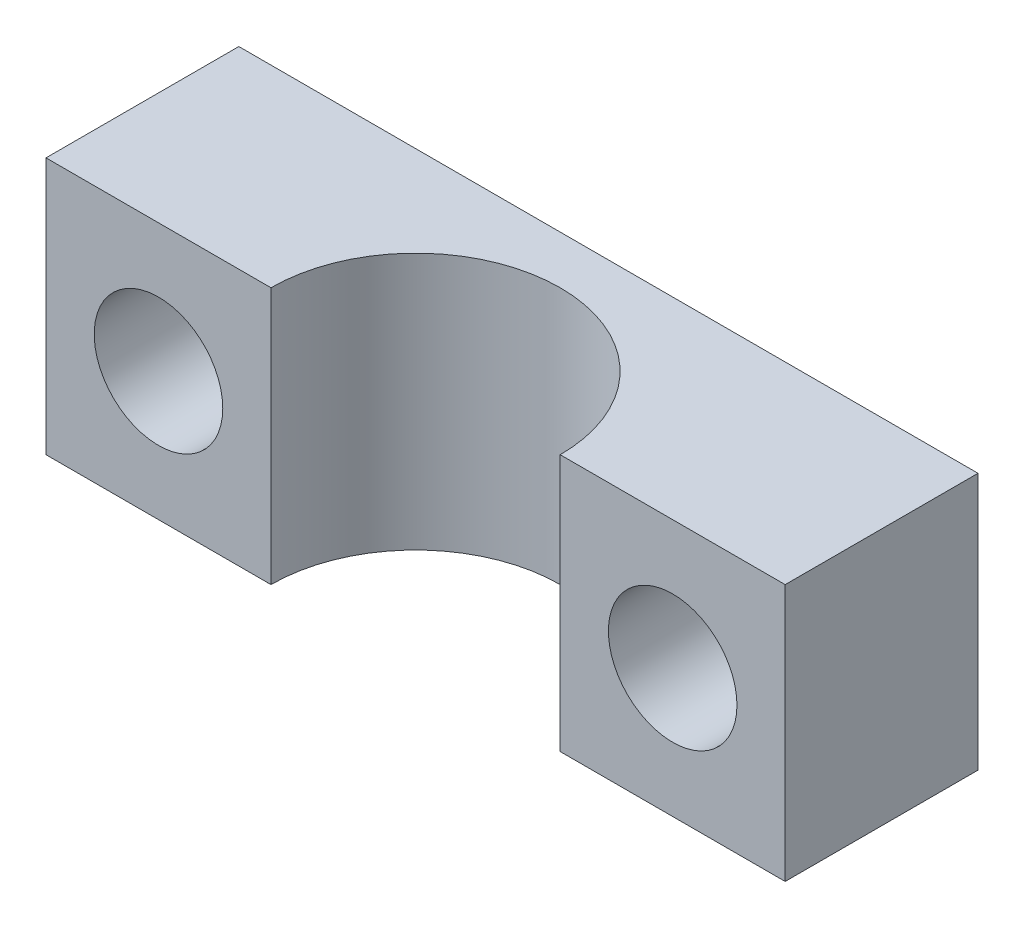
ISO-10303-21;
HEADER;
FILE_DESCRIPTION(('STEP AP214'),'2;1');
FILE_NAME('part.step','',(''),(''),'','','');
FILE_SCHEMA(('AUTOMOTIVE_DESIGN { 1 0 10303 214 1 1 1 1 }'));
ENDSEC;
DATA;
#1=APPLICATION_CONTEXT('core data for automotive mechanical design processes');
#2=APPLICATION_PROTOCOL_DEFINITION('international standard','automotive_design',2000,#1);
#3=PRODUCT_CONTEXT('',#1,'mechanical');
#4=PRODUCT('Part','Part','',(#3));
#5=PRODUCT_RELATED_PRODUCT_CATEGORY('part','',(#4));
#6=PRODUCT_DEFINITION_FORMATION('','',#4);
#7=PRODUCT_DEFINITION_CONTEXT('part definition',#1,'design');
#8=PRODUCT_DEFINITION('design','',#6,#7);
#9=PRODUCT_DEFINITION_SHAPE('','',#8);
#10=(LENGTH_UNIT() NAMED_UNIT(*) SI_UNIT(.MILLI.,.METRE.));
#11=(NAMED_UNIT(*) PLANE_ANGLE_UNIT() SI_UNIT($,.RADIAN.));
#12=(NAMED_UNIT(*) SI_UNIT($,.STERADIAN.) SOLID_ANGLE_UNIT());
#13=UNCERTAINTY_MEASURE_WITH_UNIT(LENGTH_MEASURE(1.E-05),#10,'distance_accuracy_value','');
#14=(GEOMETRIC_REPRESENTATION_CONTEXT(3) GLOBAL_UNCERTAINTY_ASSIGNED_CONTEXT((#13)) GLOBAL_UNIT_ASSIGNED_CONTEXT((#10,
#11,#12)) REPRESENTATION_CONTEXT('',''));
#15=CARTESIAN_POINT('',(0.,0.,0.));
#16=DIRECTION('',(0.,0.,1.));
#17=DIRECTION('',(1.,0.,0.));
#18=AXIS2_PLACEMENT_3D('',#15,#16,#17);
#19=CARTESIAN_POINT('',(-59.6296296296296,43.505291005291,60.));
#20=DIRECTION('',(1.,0.,0.));
#21=DIRECTION('',(0.,0.,-1.));
#22=AXIS2_PLACEMENT_3D('',#19,#20,#21);
#23=PLANE('',#22);
#24=DIRECTION('',(0.,0.,-1.));
#25=VECTOR('',#24,1.);
#26=CARTESIAN_POINT('',(-59.6296296296296,3.50529100529105,60.));
#27=LINE('',#26,#25);
#28=CARTESIAN_POINT('',(-59.6296296296296,3.50529100529105,30.));
#29=VERTEX_POINT('',#28);
#30=CARTESIAN_POINT('',(-59.6296296296296,3.50529100529105,0.));
#31=VERTEX_POINT('',#30);
#32=EDGE_CURVE('E11',#29,#31,#27,.T.);
#33=ORIENTED_EDGE('',*,*,#32,.F.);
#34=DIRECTION('',(0.,1.,0.));
#35=VECTOR('',#34,1.);
#36=CARTESIAN_POINT('',(-59.6296296296296,-16.494708994709,30.));
#37=LINE('',#36,#35);
#38=CARTESIAN_POINT('',(-59.6296296296296,43.505291005291,30.));
#39=VERTEX_POINT('',#38);
#40=EDGE_CURVE('E117',#29,#39,#37,.T.);
#41=ORIENTED_EDGE('',*,*,#40,.T.);
#42=DIRECTION('',(0.,0.,-1.));
#43=VECTOR('',#42,1.);
#44=CARTESIAN_POINT('',(-59.6296296296296,43.505291005291,60.));
#45=LINE('',#44,#43);
#46=CARTESIAN_POINT('',(-59.6296296296296,43.505291005291,0.));
#47=VERTEX_POINT('',#46);
#48=EDGE_CURVE('E62',#39,#47,#45,.T.);
#49=ORIENTED_EDGE('',*,*,#48,.T.);
#50=DIRECTION('',(0.,-1.,0.));
#51=VECTOR('',#50,1.);
#52=CARTESIAN_POINT('',(-59.6296296296296,43.505291005291,0.));
#53=LINE('',#52,#51);
#54=EDGE_CURVE('E127',#47,#31,#53,.T.);
#55=ORIENTED_EDGE('',*,*,#54,.T.);
#56=EDGE_LOOP('',(#33,#41,#49,#55));
#57=FACE_BOUND('',#56,.T.);
#58=ADVANCED_FACE('F40',(#57),#23,.F.);
#59=CARTESIAN_POINT('',(-59.6296296296296,3.50529100529105,60.));
#60=DIRECTION('',(0.,1.,0.));
#61=DIRECTION('',(0.,0.,1.));
#62=AXIS2_PLACEMENT_3D('',#59,#60,#61);
#63=PLANE('',#62);
#64=CARTESIAN_POINT('',(-2.12962962962962,3.50529100529105,30.));
#65=DIRECTION('',(0.,1.,0.));
#66=DIRECTION('',(0.,0.,1.));
#67=AXIS2_PLACEMENT_3D('',#64,#65,#66);
#68=CIRCLE('',#67,22.5);
#69=CARTESIAN_POINT('',(20.3703703703704,3.50529100529105,30.));
#70=VERTEX_POINT('',#69);
#71=CARTESIAN_POINT('',(-24.6296296296296,3.50529100529105,30.));
#72=VERTEX_POINT('',#71);
#73=EDGE_CURVE('E101',#70,#72,#68,.T.);
#74=ORIENTED_EDGE('',*,*,#73,.T.);
#75=DIRECTION('',(-1.,0.,0.));
#76=VECTOR('',#75,1.);
#77=CARTESIAN_POINT('',(-59.6296296296296,3.50529100529105,30.));
#78=LINE('',#77,#76);
#79=EDGE_CURVE('E124',#72,#29,#78,.T.);
#80=ORIENTED_EDGE('',*,*,#79,.T.);
#81=ORIENTED_EDGE('',*,*,#32,.T.);
#82=DIRECTION('',(1.,0.,0.));
#83=VECTOR('',#82,1.);
#84=CARTESIAN_POINT('',(-59.6296296296296,3.50529100529105,0.));
#85=LINE('',#84,#83);
#86=CARTESIAN_POINT('',(55.3703703703704,3.50529100529105,0.));
#87=VERTEX_POINT('',#86);
#88=EDGE_CURVE('E129',#31,#87,#85,.T.);
#89=ORIENTED_EDGE('',*,*,#88,.T.);
#90=DIRECTION('',(0.,0.,-1.));
#91=VECTOR('',#90,1.);
#92=CARTESIAN_POINT('',(55.3703703703704,3.50529100529105,60.));
#93=LINE('',#92,#91);
#94=CARTESIAN_POINT('',(55.3703703703704,3.50529100529105,30.));
#95=VERTEX_POINT('',#94);
#96=EDGE_CURVE('E47',#95,#87,#93,.T.);
#97=ORIENTED_EDGE('',*,*,#96,.F.);
#98=DIRECTION('',(-1.,0.,0.));
#99=VECTOR('',#98,1.);
#100=CARTESIAN_POINT('',(-59.6296296296296,3.50529100529105,30.));
#101=LINE('',#100,#99);
#102=EDGE_CURVE('E119',#95,#70,#101,.T.);
#103=ORIENTED_EDGE('',*,*,#102,.T.);
#104=EDGE_LOOP('',(#74,#80,#81,#89,#97,#103));
#105=FACE_BOUND('',#104,.T.);
#106=ADVANCED_FACE('F146',(#105),#63,.F.);
#107=CARTESIAN_POINT('',(55.3703703703704,43.505291005291,60.));
#108=DIRECTION('',(-1.,0.,0.));
#109=DIRECTION('',(0.,-1.,0.));
#110=AXIS2_PLACEMENT_3D('',#107,#108,#109);
#111=PLANE('',#110);
#112=DIRECTION('',(0.,0.,-1.));
#113=VECTOR('',#112,1.);
#114=CARTESIAN_POINT('',(55.3703703703704,43.505291005291,60.));
#115=LINE('',#114,#113);
#116=CARTESIAN_POINT('',(55.3703703703704,43.505291005291,30.));
#117=VERTEX_POINT('',#116);
#118=CARTESIAN_POINT('',(55.3703703703704,43.505291005291,0.));
#119=VERTEX_POINT('',#118);
#120=EDGE_CURVE('E138',#117,#119,#115,.T.);
#121=ORIENTED_EDGE('',*,*,#120,.F.);
#122=DIRECTION('',(0.,1.,0.));
#123=VECTOR('',#122,1.);
#124=CARTESIAN_POINT('',(55.3703703703704,-16.494708994709,30.));
#125=LINE('',#124,#123);
#126=EDGE_CURVE('E54',#95,#117,#125,.T.);
#127=ORIENTED_EDGE('',*,*,#126,.F.);
#128=ORIENTED_EDGE('',*,*,#96,.T.);
#129=DIRECTION('',(0.,1.,0.));
#130=VECTOR('',#129,1.);
#131=CARTESIAN_POINT('',(55.3703703703704,43.505291005291,0.));
#132=LINE('',#131,#130);
#133=EDGE_CURVE('E132',#87,#119,#132,.T.);
#134=ORIENTED_EDGE('',*,*,#133,.T.);
#135=EDGE_LOOP('',(#121,#127,#128,#134));
#136=FACE_BOUND('',#135,.T.);
#137=ADVANCED_FACE('F141',(#136),#111,.F.);
#138=CARTESIAN_POINT('',(-59.6296296296296,43.505291005291,60.));
#139=DIRECTION('',(0.,-1.,0.));
#140=DIRECTION('',(0.,0.,-1.));
#141=AXIS2_PLACEMENT_3D('',#138,#139,#140);
#142=PLANE('',#141);
#143=ORIENTED_EDGE('',*,*,#48,.F.);
#144=DIRECTION('',(-1.,0.,0.));
#145=VECTOR('',#144,1.);
#146=CARTESIAN_POINT('',(-59.6296296296296,43.505291005291,30.));
#147=LINE('',#146,#145);
#148=CARTESIAN_POINT('',(-24.6296296296296,43.505291005291,30.));
#149=VERTEX_POINT('',#148);
#150=EDGE_CURVE('E112',#149,#39,#147,.T.);
#151=ORIENTED_EDGE('',*,*,#150,.F.);
#152=CARTESIAN_POINT('',(-2.12962962962962,43.505291005291,30.));
#153=DIRECTION('',(0.,1.,0.));
#154=DIRECTION('',(0.,0.,1.));
#155=AXIS2_PLACEMENT_3D('',#152,#153,#154);
#156=CIRCLE('',#155,22.5);
#157=CARTESIAN_POINT('',(20.3703703703704,43.505291005291,30.));
#158=VERTEX_POINT('',#157);
#159=EDGE_CURVE('E98',#158,#149,#156,.T.);
#160=ORIENTED_EDGE('',*,*,#159,.F.);
#161=DIRECTION('',(-1.,0.,0.));
#162=VECTOR('',#161,1.);
#163=CARTESIAN_POINT('',(20.3703703703704,43.505291005291,30.));
#164=LINE('',#163,#162);
#165=EDGE_CURVE('E105',#117,#158,#164,.T.);
#166=ORIENTED_EDGE('',*,*,#165,.F.);
#167=ORIENTED_EDGE('',*,*,#120,.T.);
#168=DIRECTION('',(-1.,0.,0.));
#169=VECTOR('',#168,1.);
#170=CARTESIAN_POINT('',(-59.6296296296296,43.505291005291,0.));
#171=LINE('',#170,#169);
#172=EDGE_CURVE('E135',#119,#47,#171,.T.);
#173=ORIENTED_EDGE('',*,*,#172,.T.);
#174=EDGE_LOOP('',(#143,#151,#160,#166,#167,#173));
#175=FACE_BOUND('',#174,.T.);
#176=ADVANCED_FACE('F111',(#175),#142,.F.);
#177=CARTESIAN_POINT('',(0.,0.,0.));
#178=DIRECTION('',(0.,0.,1.));
#179=DIRECTION('',(1.,0.,0.));
#180=AXIS2_PLACEMENT_3D('',#177,#178,#179);
#181=PLANE('',#180);
#182=CARTESIAN_POINT('',(-42.1296296296296,23.505291005291,0.));
#183=DIRECTION('',(0.,0.,1.));
#184=DIRECTION('',(1.,0.,0.));
#185=AXIS2_PLACEMENT_3D('',#182,#183,#184);
#186=CIRCLE('',#185,10.);
#187=CARTESIAN_POINT('',(-32.1296296296296,23.505291005291,0.));
#188=VERTEX_POINT('',#187);
#189=EDGE_CURVE('E109',#188,#188,#186,.T.);
#190=ORIENTED_EDGE('',*,*,#189,.T.);
#191=EDGE_LOOP('',(#190));
#192=FACE_BOUND('',#191,.T.);
#193=CARTESIAN_POINT('',(37.8703703703704,23.505291005291,0.));
#194=DIRECTION('',(0.,0.,1.));
#195=DIRECTION('',(1.,0.,0.));
#196=AXIS2_PLACEMENT_3D('',#193,#194,#195);
#197=CIRCLE('',#196,10.);
#198=CARTESIAN_POINT('',(47.8703703703704,23.505291005291,0.));
#199=VERTEX_POINT('',#198);
#200=EDGE_CURVE('E190',#199,#199,#197,.T.);
#201=ORIENTED_EDGE('',*,*,#200,.T.);
#202=EDGE_LOOP('',(#201));
#203=FACE_BOUND('',#202,.T.);
#204=ORIENTED_EDGE('',*,*,#54,.F.);
#205=ORIENTED_EDGE('',*,*,#172,.F.);
#206=ORIENTED_EDGE('',*,*,#133,.F.);
#207=ORIENTED_EDGE('',*,*,#88,.F.);
#208=EDGE_LOOP('',(#204,#205,#206,#207));
#209=FACE_BOUND('',#208,.T.);
#210=ADVANCED_FACE('F150',(#192,#203,#209),#181,.F.);
#211=CARTESIAN_POINT('',(-59.6296296296296,-16.494708994709,30.));
#212=DIRECTION('',(0.,0.,-1.));
#213=DIRECTION('',(-1.,0.,0.));
#214=AXIS2_PLACEMENT_3D('',#211,#212,#213);
#215=PLANE('',#214);
#216=CARTESIAN_POINT('',(-42.1296296296296,23.505291005291,30.));
#217=DIRECTION('',(0.,0.,1.));
#218=DIRECTION('',(1.,0.,0.));
#219=AXIS2_PLACEMENT_3D('',#216,#217,#218);
#220=CIRCLE('',#219,10.);
#221=CARTESIAN_POINT('',(-32.1296296296296,23.505291005291,30.));
#222=VERTEX_POINT('',#221);
#223=EDGE_CURVE('E187',#222,#222,#220,.T.);
#224=ORIENTED_EDGE('',*,*,#223,.F.);
#225=EDGE_LOOP('',(#224));
#226=FACE_BOUND('',#225,.T.);
#227=DIRECTION('',(0.,1.,0.));
#228=VECTOR('',#227,1.);
#229=CARTESIAN_POINT('',(-24.6296296296296,-16.494708994709,30.));
#230=LINE('',#229,#228);
#231=EDGE_CURVE('E103',#72,#149,#230,.T.);
#232=ORIENTED_EDGE('',*,*,#231,.T.);
#233=ORIENTED_EDGE('',*,*,#150,.T.);
#234=ORIENTED_EDGE('',*,*,#40,.F.);
#235=ORIENTED_EDGE('',*,*,#79,.F.);
#236=EDGE_LOOP('',(#232,#233,#234,#235));
#237=FACE_BOUND('',#236,.T.);
#238=ADVANCED_FACE('F152',(#226,#237),#215,.F.);
#239=CARTESIAN_POINT('',(-2.12962962962962,-16.494708994709,30.));
#240=DIRECTION('',(0.,1.,0.));
#241=DIRECTION('',(0.,0.,1.));
#242=AXIS2_PLACEMENT_3D('',#239,#240,#241);
#243=CYLINDRICAL_SURFACE('',#242,22.5);
#244=DIRECTION('',(0.,1.,0.));
#245=VECTOR('',#244,1.);
#246=CARTESIAN_POINT('',(20.3703703703704,-16.494708994709,30.));
#247=LINE('',#246,#245);
#248=EDGE_CURVE('E94',#70,#158,#247,.T.);
#249=ORIENTED_EDGE('',*,*,#248,.T.);
#250=ORIENTED_EDGE('',*,*,#159,.T.);
#251=ORIENTED_EDGE('',*,*,#231,.F.);
#252=ORIENTED_EDGE('',*,*,#73,.F.);
#253=EDGE_LOOP('',(#249,#250,#251,#252));
#254=FACE_BOUND('',#253,.T.);
#255=ADVANCED_FACE('F95',(#254),#243,.F.);
#256=CARTESIAN_POINT('',(20.3703703703704,-16.494708994709,30.));
#257=DIRECTION('',(0.,0.,-1.));
#258=DIRECTION('',(-1.,0.,0.));
#259=AXIS2_PLACEMENT_3D('',#256,#257,#258);
#260=PLANE('',#259);
#261=CARTESIAN_POINT('',(37.8703703703704,23.505291005291,30.));
#262=DIRECTION('',(0.,0.,1.));
#263=DIRECTION('',(1.,0.,0.));
#264=AXIS2_PLACEMENT_3D('',#261,#262,#263);
#265=CIRCLE('',#264,10.);
#266=CARTESIAN_POINT('',(47.8703703703704,23.505291005291,30.));
#267=VERTEX_POINT('',#266);
#268=EDGE_CURVE('E186',#267,#267,#265,.T.);
#269=ORIENTED_EDGE('',*,*,#268,.F.);
#270=EDGE_LOOP('',(#269));
#271=FACE_BOUND('',#270,.T.);
#272=ORIENTED_EDGE('',*,*,#126,.T.);
#273=ORIENTED_EDGE('',*,*,#165,.T.);
#274=ORIENTED_EDGE('',*,*,#248,.F.);
#275=ORIENTED_EDGE('',*,*,#102,.F.);
#276=EDGE_LOOP('',(#272,#273,#274,#275));
#277=FACE_BOUND('',#276,.T.);
#278=ADVANCED_FACE('F106',(#271,#277),#260,.F.);
#279=CARTESIAN_POINT('',(37.8703703703704,23.505291005291,-30.));
#280=DIRECTION('',(0.,0.,1.));
#281=DIRECTION('',(1.,0.,0.));
#282=AXIS2_PLACEMENT_3D('',#279,#280,#281);
#283=CYLINDRICAL_SURFACE('',#282,10.);
#284=ORIENTED_EDGE('',*,*,#268,.T.);
#285=EDGE_LOOP('',(#284));
#286=FACE_BOUND('',#285,.T.);
#287=ORIENTED_EDGE('',*,*,#200,.F.);
#288=EDGE_LOOP('',(#287));
#289=FACE_BOUND('',#288,.T.);
#290=ADVANCED_FACE('F177',(#286,#289),#283,.F.);
#291=CARTESIAN_POINT('',(-42.1296296296296,23.505291005291,-30.));
#292=DIRECTION('',(0.,0.,1.));
#293=DIRECTION('',(1.,0.,0.));
#294=AXIS2_PLACEMENT_3D('',#291,#292,#293);
#295=CYLINDRICAL_SURFACE('',#294,10.);
#296=ORIENTED_EDGE('',*,*,#223,.T.);
#297=EDGE_LOOP('',(#296));
#298=FACE_BOUND('',#297,.T.);
#299=ORIENTED_EDGE('',*,*,#189,.F.);
#300=EDGE_LOOP('',(#299));
#301=FACE_BOUND('',#300,.T.);
#302=ADVANCED_FACE('F182',(#298,#301),#295,.F.);
#303=CLOSED_SHELL('',(#58,#106,#137,#176,#210,#238,#255,#278,#290,#302));
#304=MANIFOLD_SOLID_BREP('B2',#303);
#305=ADVANCED_BREP_SHAPE_REPRESENTATION('',(#18,#304),#14);
#306=SHAPE_DEFINITION_REPRESENTATION(#9,#305);
ENDSEC;
END-ISO-10303-21;
